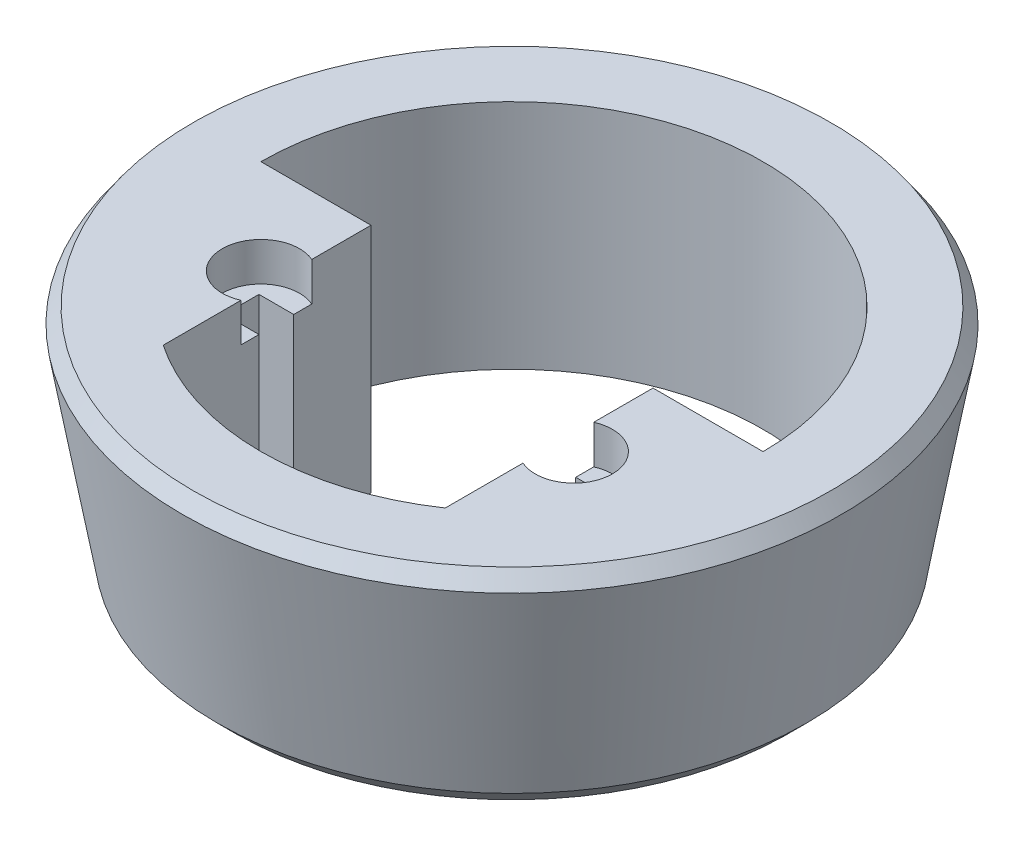
ISO-10303-21;
HEADER;
FILE_DESCRIPTION(('STEP AP214'),'2;1');
FILE_NAME('part.step','',(''),(''),'','','');
FILE_SCHEMA(('AUTOMOTIVE_DESIGN { 1 0 10303 214 1 1 1 1 }'));
ENDSEC;
DATA;
#1=APPLICATION_CONTEXT('core data for automotive mechanical design processes');
#2=APPLICATION_PROTOCOL_DEFINITION('international standard','automotive_design',2000,#1);
#3=PRODUCT_CONTEXT('',#1,'mechanical');
#4=PRODUCT('Part','Part','',(#3));
#5=PRODUCT_RELATED_PRODUCT_CATEGORY('part','',(#4));
#6=PRODUCT_DEFINITION_FORMATION('','',#4);
#7=PRODUCT_DEFINITION_CONTEXT('part definition',#1,'design');
#8=PRODUCT_DEFINITION('design','',#6,#7);
#9=PRODUCT_DEFINITION_SHAPE('','',#8);
#10=(LENGTH_UNIT() NAMED_UNIT(*) SI_UNIT(.MILLI.,.METRE.));
#11=(NAMED_UNIT(*) PLANE_ANGLE_UNIT() SI_UNIT($,.RADIAN.));
#12=(NAMED_UNIT(*) SI_UNIT($,.STERADIAN.) SOLID_ANGLE_UNIT());
#13=UNCERTAINTY_MEASURE_WITH_UNIT(LENGTH_MEASURE(1.E-05),#10,'distance_accuracy_value','');
#14=(GEOMETRIC_REPRESENTATION_CONTEXT(3) GLOBAL_UNCERTAINTY_ASSIGNED_CONTEXT((#13)) GLOBAL_UNIT_ASSIGNED_CONTEXT((#10,
#11,#12)) REPRESENTATION_CONTEXT('',''));
#15=CARTESIAN_POINT('',(0.,0.,0.));
#16=DIRECTION('',(0.,0.,1.));
#17=DIRECTION('',(1.,0.,0.));
#18=AXIS2_PLACEMENT_3D('',#15,#16,#17);
#19=CARTESIAN_POINT('',(-9.1,-12.,5.8));
#20=DIRECTION('',(-1.,0.,0.));
#21=DIRECTION('',(0.,0.,1.));
#22=AXIS2_PLACEMENT_3D('',#19,#20,#21);
#23=PLANE('',#22);
#24=DIRECTION('',(0.,0.,-1.));
#25=VECTOR('',#24,1.);
#26=CARTESIAN_POINT('',(-9.1,-2.,5.8));
#27=LINE('',#26,#25);
#28=CARTESIAN_POINT('',(-9.1,-2.,5.8));
#29=VERTEX_POINT('',#28);
#30=CARTESIAN_POINT('',(-9.1,-2.,4.));
#31=VERTEX_POINT('',#30);
#32=EDGE_CURVE('E361',#29,#31,#27,.T.);
#33=ORIENTED_EDGE('',*,*,#32,.F.);
#34=DIRECTION('',(0.,1.,0.));
#35=VECTOR('',#34,1.);
#36=CARTESIAN_POINT('',(-9.1,-12.,5.8));
#37=LINE('',#36,#35);
#38=CARTESIAN_POINT('',(-9.1,-12.,5.8));
#39=VERTEX_POINT('',#38);
#40=EDGE_CURVE('E237',#39,#29,#37,.T.);
#41=ORIENTED_EDGE('',*,*,#40,.F.);
#42=DIRECTION('',(0.,0.,1.));
#43=VECTOR('',#42,1.);
#44=CARTESIAN_POINT('',(-9.1,-12.,5.8));
#45=LINE('',#44,#43);
#46=CARTESIAN_POINT('',(-9.1,-12.,4.));
#47=VERTEX_POINT('',#46);
#48=EDGE_CURVE('E202',#47,#39,#45,.T.);
#49=ORIENTED_EDGE('',*,*,#48,.F.);
#50=DIRECTION('',(0.,1.,0.));
#51=VECTOR('',#50,1.);
#52=CARTESIAN_POINT('',(-9.1,-12.,4.));
#53=LINE('',#52,#51);
#54=EDGE_CURVE('E203',#47,#31,#53,.T.);
#55=ORIENTED_EDGE('',*,*,#54,.T.);
#56=EDGE_LOOP('',(#33,#41,#49,#55));
#57=FACE_BOUND('',#56,.T.);
#58=ADVANCED_FACE('F33',(#57),#23,.F.);
#59=CARTESIAN_POINT('',(-9.1,-12.,4.));
#60=DIRECTION('',(0.,0.,-1.));
#61=DIRECTION('',(-1.,0.,0.));
#62=AXIS2_PLACEMENT_3D('',#59,#60,#61);
#63=PLANE('',#62);
#64=DIRECTION('',(1.,0.,0.));
#65=VECTOR('',#64,1.);
#66=CARTESIAN_POINT('',(-9.1,-2.,4.));
#67=LINE('',#66,#65);
#68=CARTESIAN_POINT('',(-7.3,-2.,4.));
#69=VERTEX_POINT('',#68);
#70=EDGE_CURVE('E363',#31,#69,#67,.T.);
#71=ORIENTED_EDGE('',*,*,#70,.F.);
#72=ORIENTED_EDGE('',*,*,#54,.F.);
#73=DIRECTION('',(-1.,0.,0.));
#74=VECTOR('',#73,1.);
#75=CARTESIAN_POINT('',(-9.1,-12.,4.));
#76=LINE('',#75,#74);
#77=CARTESIAN_POINT('',(-7.3,-12.,4.));
#78=VERTEX_POINT('',#77);
#79=EDGE_CURVE('E240',#78,#47,#76,.T.);
#80=ORIENTED_EDGE('',*,*,#79,.F.);
#81=DIRECTION('',(0.,1.,0.));
#82=VECTOR('',#81,1.);
#83=CARTESIAN_POINT('',(-7.3,-12.,4.));
#84=LINE('',#83,#82);
#85=EDGE_CURVE('E207',#78,#69,#84,.T.);
#86=ORIENTED_EDGE('',*,*,#85,.T.);
#87=EDGE_LOOP('',(#71,#72,#80,#86));
#88=FACE_BOUND('',#87,.T.);
#89=ADVANCED_FACE('F274',(#88),#63,.F.);
#90=CARTESIAN_POINT('',(-9.1,-12.,5.8));
#91=DIRECTION('',(0.,0.,1.));
#92=DIRECTION('',(1.,0.,0.));
#93=AXIS2_PLACEMENT_3D('',#90,#91,#92);
#94=PLANE('',#93);
#95=DIRECTION('',(-1.,0.,0.));
#96=VECTOR('',#95,1.);
#97=CARTESIAN_POINT('',(-9.1,-2.,5.8));
#98=LINE('',#97,#96);
#99=CARTESIAN_POINT('',(-7.3,-2.,5.8));
#100=VERTEX_POINT('',#99);
#101=EDGE_CURVE('E206',#100,#29,#98,.T.);
#102=ORIENTED_EDGE('',*,*,#101,.F.);
#103=DIRECTION('',(0.,1.,0.));
#104=VECTOR('',#103,1.);
#105=CARTESIAN_POINT('',(-7.3,-12.,5.8));
#106=LINE('',#105,#104);
#107=CARTESIAN_POINT('',(-7.3,-12.,5.8));
#108=VERTEX_POINT('',#107);
#109=EDGE_CURVE('E234',#108,#100,#106,.T.);
#110=ORIENTED_EDGE('',*,*,#109,.F.);
#111=DIRECTION('',(1.,0.,0.));
#112=VECTOR('',#111,1.);
#113=CARTESIAN_POINT('',(-9.1,-12.,5.8));
#114=LINE('',#113,#112);
#115=EDGE_CURVE('E305',#39,#108,#114,.T.);
#116=ORIENTED_EDGE('',*,*,#115,.F.);
#117=ORIENTED_EDGE('',*,*,#40,.T.);
#118=EDGE_LOOP('',(#102,#110,#116,#117));
#119=FACE_BOUND('',#118,.T.);
#120=ADVANCED_FACE('F266',(#119),#94,.F.);
#121=CARTESIAN_POINT('',(0.,0.,0.));
#122=DIRECTION('',(0.,1.,0.));
#123=DIRECTION('',(0.,0.,1.));
#124=AXIS2_PLACEMENT_3D('',#121,#122,#123);
#125=PLANE('',#124);
#126=CARTESIAN_POINT('',(0.,0.,0.));
#127=DIRECTION('',(0.,1.,0.));
#128=DIRECTION('',(0.,0.,1.));
#129=AXIS2_PLACEMENT_3D('',#126,#127,#128);
#130=CIRCLE('',#129,16.5088020253873);
#131=CARTESIAN_POINT('',(0.,0.,16.5088020253873));
#132=VERTEX_POINT('',#131);
#133=EDGE_CURVE('E248',#132,#132,#130,.T.);
#134=ORIENTED_EDGE('',*,*,#133,.T.);
#135=EDGE_LOOP('',(#134));
#136=FACE_BOUND('',#135,.T.);
#137=CARTESIAN_POINT('',(8.1,0.,4.9));
#138=DIRECTION('',(0.,1.,0.));
#139=DIRECTION('',(0.,0.,-1.));
#140=AXIS2_PLACEMENT_3D('',#137,#138,#139);
#141=CIRCLE('',#140,2.);
#142=CARTESIAN_POINT('',(7.30000000000001,0.,6.73303027798233));
#143=VERTEX_POINT('',#142);
#144=CARTESIAN_POINT('',(7.30000000000001,0.,3.06696972201766));
#145=VERTEX_POINT('',#144);
#146=EDGE_CURVE('E158',#143,#145,#141,.T.);
#147=ORIENTED_EDGE('',*,*,#146,.F.);
#148=DIRECTION('',(0.,0.,-1.));
#149=VECTOR('',#148,1.);
#150=CARTESIAN_POINT('',(7.30000000000001,0.,5.8));
#151=LINE('',#150,#149);
#152=CARTESIAN_POINT('',(7.30000000000001,0.,10.7568582773968));
#153=VERTEX_POINT('',#152);
#154=EDGE_CURVE('E186',#153,#143,#151,.T.);
#155=ORIENTED_EDGE('',*,*,#154,.F.);
#156=CARTESIAN_POINT('',(0.,0.,0.));
#157=DIRECTION('',(0.,1.,0.));
#158=DIRECTION('',(0.,0.,1.));
#159=AXIS2_PLACEMENT_3D('',#156,#157,#158);
#160=CIRCLE('',#159,13.);
#161=CARTESIAN_POINT('',(-7.3,0.,10.7568582773968));
#162=VERTEX_POINT('',#161);
#163=EDGE_CURVE('E190',#162,#153,#160,.T.);
#164=ORIENTED_EDGE('',*,*,#163,.F.);
#165=DIRECTION('',(0.,0.,1.));
#166=VECTOR('',#165,1.);
#167=CARTESIAN_POINT('',(-7.3,0.,5.8));
#168=LINE('',#167,#166);
#169=CARTESIAN_POINT('',(-7.3,0.,6.73303027798234));
#170=VERTEX_POINT('',#169);
#171=EDGE_CURVE('E346',#170,#162,#168,.T.);
#172=ORIENTED_EDGE('',*,*,#171,.F.);
#173=CARTESIAN_POINT('',(-8.1,0.,4.9));
#174=DIRECTION('',(0.,1.,0.));
#175=DIRECTION('',(0.,0.,1.));
#176=AXIS2_PLACEMENT_3D('',#173,#174,#175);
#177=CIRCLE('',#176,2.);
#178=CARTESIAN_POINT('',(-7.3,0.,3.06696972201766));
#179=VERTEX_POINT('',#178);
#180=EDGE_CURVE('E179',#179,#170,#177,.T.);
#181=ORIENTED_EDGE('',*,*,#180,.F.);
#182=DIRECTION('',(0.,0.,1.));
#183=VECTOR('',#182,1.);
#184=CARTESIAN_POINT('',(-7.3,0.,4.));
#185=LINE('',#184,#183);
#186=CARTESIAN_POINT('',(-7.3,0.,0.));
#187=VERTEX_POINT('',#186);
#188=EDGE_CURVE('E199',#187,#179,#185,.T.);
#189=ORIENTED_EDGE('',*,*,#188,.F.);
#190=DIRECTION('',(1.,0.,0.));
#191=VECTOR('',#190,1.);
#192=CARTESIAN_POINT('',(-7.3,0.,0.));
#193=LINE('',#192,#191);
#194=CARTESIAN_POINT('',(-13.,0.,0.));
#195=VERTEX_POINT('',#194);
#196=EDGE_CURVE('E196',#195,#187,#193,.T.);
#197=ORIENTED_EDGE('',*,*,#196,.F.);
#198=CARTESIAN_POINT('',(0.,0.,0.));
#199=DIRECTION('',(0.,1.,0.));
#200=DIRECTION('',(0.,0.,1.));
#201=AXIS2_PLACEMENT_3D('',#198,#199,#200);
#202=CIRCLE('',#201,13.);
#203=CARTESIAN_POINT('',(13.,0.,0.));
#204=VERTEX_POINT('',#203);
#205=EDGE_CURVE('E188',#204,#195,#202,.T.);
#206=ORIENTED_EDGE('',*,*,#205,.F.);
#207=DIRECTION('',(1.,0.,0.));
#208=VECTOR('',#207,1.);
#209=CARTESIAN_POINT('',(7.3,0.,0.));
#210=LINE('',#209,#208);
#211=CARTESIAN_POINT('',(7.3,0.,0.));
#212=VERTEX_POINT('',#211);
#213=EDGE_CURVE('E185',#212,#204,#210,.T.);
#214=ORIENTED_EDGE('',*,*,#213,.F.);
#215=DIRECTION('',(0.,0.,-1.));
#216=VECTOR('',#215,1.);
#217=CARTESIAN_POINT('',(7.30000000000001,0.,4.));
#218=LINE('',#217,#216);
#219=EDGE_CURVE('E175',#145,#212,#218,.T.);
#220=ORIENTED_EDGE('',*,*,#219,.F.);
#221=EDGE_LOOP('',(#147,#155,#164,#172,#181,#189,#197,#206,#214,#220));
#222=FACE_BOUND('',#221,.T.);
#223=ADVANCED_FACE('F182',(#136,#222),#125,.T.);
#224=CARTESIAN_POINT('',(0.,0.,0.));
#225=DIRECTION('',(0.,1.,0.));
#226=DIRECTION('',(0.,0.,1.));
#227=AXIS2_PLACEMENT_3D('',#224,#225,#226);
#228=CONICAL_SURFACE('',#227,17.2,0.173245666452365);
#229=CARTESIAN_POINT('',(0.,-0.788024373724577,0.));
#230=DIRECTION('',(0.,-1.,0.));
#231=DIRECTION('',(0.,0.,-1.));
#232=AXIS2_PLACEMENT_3D('',#229,#230,#231);
#233=CIRCLE('',#232,17.0620957345982);
#234=CARTESIAN_POINT('',(0.,-0.788024373724577,-17.0620957345982));
#235=VERTEX_POINT('',#234);
#236=EDGE_CURVE('E41',#235,#235,#233,.T.);
#237=ORIENTED_EDGE('',*,*,#236,.T.);
#238=EDGE_LOOP('',(#237));
#239=FACE_BOUND('',#238,.T.);
#240=CARTESIAN_POINT('',(0.,-11.030303030303,0.));
#241=DIRECTION('',(0.,-1.,0.));
#242=DIRECTION('',(0.,0.,-1.));
#243=AXIS2_PLACEMENT_3D('',#240,#241,#242);
#244=CIRCLE('',#243,15.269696969697);
#245=CARTESIAN_POINT('',(0.,-11.030303030303,15.269696969697));
#246=VERTEX_POINT('',#245);
#247=EDGE_CURVE('E251',#246,#246,#244,.F.);
#248=ORIENTED_EDGE('',*,*,#247,.T.);
#249=EDGE_LOOP('',(#248));
#250=FACE_BOUND('',#249,.T.);
#251=ADVANCED_FACE('F256',(#239,#250),#228,.T.);
#252=CARTESIAN_POINT('',(-15.1,-12.,0.));
#253=DIRECTION('',(0.,-1.,0.));
#254=DIRECTION('',(0.,0.,-1.));
#255=AXIS2_PLACEMENT_3D('',#252,#253,#254);
#256=PLANE('',#255);
#257=CARTESIAN_POINT('',(0.,-12.,0.));
#258=DIRECTION('',(0.,-1.,0.));
#259=DIRECTION('',(0.,0.,-1.));
#260=AXIS2_PLACEMENT_3D('',#257,#258,#259);
#261=CIRCLE('',#260,14.3);
#262=CARTESIAN_POINT('',(0.,-12.,14.3));
#263=VERTEX_POINT('',#262);
#264=EDGE_CURVE('E11',#263,#263,#261,.T.);
#265=ORIENTED_EDGE('',*,*,#264,.T.);
#266=EDGE_LOOP('',(#265));
#267=FACE_BOUND('',#266,.T.);
#268=ORIENTED_EDGE('',*,*,#48,.T.);
#269=ORIENTED_EDGE('',*,*,#115,.T.);
#270=DIRECTION('',(0.,0.,1.));
#271=VECTOR('',#270,1.);
#272=CARTESIAN_POINT('',(-7.3,-12.,5.8));
#273=LINE('',#272,#271);
#274=CARTESIAN_POINT('',(-7.3,-12.,10.7568582773968));
#275=VERTEX_POINT('',#274);
#276=EDGE_CURVE('E309',#108,#275,#273,.T.);
#277=ORIENTED_EDGE('',*,*,#276,.T.);
#278=CARTESIAN_POINT('',(0.,-12.,0.));
#279=DIRECTION('',(0.,1.,0.));
#280=DIRECTION('',(0.,0.,1.));
#281=AXIS2_PLACEMENT_3D('',#278,#279,#280);
#282=CIRCLE('',#281,13.);
#283=CARTESIAN_POINT('',(7.30000000000001,-12.,10.7568582773968));
#284=VERTEX_POINT('',#283);
#285=EDGE_CURVE('E316',#275,#284,#282,.T.);
#286=ORIENTED_EDGE('',*,*,#285,.T.);
#287=DIRECTION('',(0.,0.,-1.));
#288=VECTOR('',#287,1.);
#289=CARTESIAN_POINT('',(7.30000000000001,-12.,5.8));
#290=LINE('',#289,#288);
#291=CARTESIAN_POINT('',(7.30000000000001,-12.,5.8));
#292=VERTEX_POINT('',#291);
#293=EDGE_CURVE('E319',#284,#292,#290,.T.);
#294=ORIENTED_EDGE('',*,*,#293,.T.);
#295=DIRECTION('',(1.,0.,0.));
#296=VECTOR('',#295,1.);
#297=CARTESIAN_POINT('',(7.30000000000001,-12.,5.8));
#298=LINE('',#297,#296);
#299=CARTESIAN_POINT('',(9.1,-12.,5.8));
#300=VERTEX_POINT('',#299);
#301=EDGE_CURVE('E322',#292,#300,#298,.T.);
#302=ORIENTED_EDGE('',*,*,#301,.T.);
#303=DIRECTION('',(0.,0.,-1.));
#304=VECTOR('',#303,1.);
#305=CARTESIAN_POINT('',(9.1,-12.,5.8));
#306=LINE('',#305,#304);
#307=CARTESIAN_POINT('',(9.1,-12.,4.));
#308=VERTEX_POINT('',#307);
#309=EDGE_CURVE('E325',#300,#308,#306,.T.);
#310=ORIENTED_EDGE('',*,*,#309,.T.);
#311=DIRECTION('',(-1.,0.,0.));
#312=VECTOR('',#311,1.);
#313=CARTESIAN_POINT('',(7.30000000000001,-12.,4.));
#314=LINE('',#313,#312);
#315=CARTESIAN_POINT('',(7.30000000000001,-12.,4.));
#316=VERTEX_POINT('',#315);
#317=EDGE_CURVE('E328',#308,#316,#314,.T.);
#318=ORIENTED_EDGE('',*,*,#317,.T.);
#319=DIRECTION('',(0.,0.,-1.));
#320=VECTOR('',#319,1.);
#321=CARTESIAN_POINT('',(7.30000000000001,-12.,4.));
#322=LINE('',#321,#320);
#323=CARTESIAN_POINT('',(7.3,-12.,0.));
#324=VERTEX_POINT('',#323);
#325=EDGE_CURVE('E331',#316,#324,#322,.T.);
#326=ORIENTED_EDGE('',*,*,#325,.T.);
#327=DIRECTION('',(1.,0.,0.));
#328=VECTOR('',#327,1.);
#329=CARTESIAN_POINT('',(7.3,-12.,0.));
#330=LINE('',#329,#328);
#331=CARTESIAN_POINT('',(13.,-12.,0.));
#332=VERTEX_POINT('',#331);
#333=EDGE_CURVE('E334',#324,#332,#330,.T.);
#334=ORIENTED_EDGE('',*,*,#333,.T.);
#335=CARTESIAN_POINT('',(0.,-12.,0.));
#336=DIRECTION('',(0.,1.,0.));
#337=DIRECTION('',(0.,0.,1.));
#338=AXIS2_PLACEMENT_3D('',#335,#336,#337);
#339=CIRCLE('',#338,13.);
#340=CARTESIAN_POINT('',(-13.,-12.,0.));
#341=VERTEX_POINT('',#340);
#342=EDGE_CURVE('E337',#332,#341,#339,.T.);
#343=ORIENTED_EDGE('',*,*,#342,.T.);
#344=DIRECTION('',(1.,0.,0.));
#345=VECTOR('',#344,1.);
#346=CARTESIAN_POINT('',(-7.3,-12.,0.));
#347=LINE('',#346,#345);
#348=CARTESIAN_POINT('',(-7.3,-12.,0.));
#349=VERTEX_POINT('',#348);
#350=EDGE_CURVE('E340',#341,#349,#347,.T.);
#351=ORIENTED_EDGE('',*,*,#350,.T.);
#352=DIRECTION('',(0.,0.,1.));
#353=VECTOR('',#352,1.);
#354=CARTESIAN_POINT('',(-7.3,-12.,4.));
#355=LINE('',#354,#353);
#356=EDGE_CURVE('E343',#349,#78,#355,.T.);
#357=ORIENTED_EDGE('',*,*,#356,.T.);
#358=ORIENTED_EDGE('',*,*,#79,.T.);
#359=EDGE_LOOP('',(#268,#269,#277,#286,#294,#302,#310,#318,#326,#334,#343,#351,#357,#358));
#360=FACE_BOUND('',#359,.T.);
#361=ADVANCED_FACE('F272',(#267,#360),#256,.T.);
#362=CARTESIAN_POINT('',(-7.3,-12.,4.));
#363=DIRECTION('',(-1.,0.,0.));
#364=DIRECTION('',(0.,0.,1.));
#365=AXIS2_PLACEMENT_3D('',#362,#363,#364);
#366=PLANE('',#365);
#367=ORIENTED_EDGE('',*,*,#188,.T.);
#368=DIRECTION('',(0.,1.,0.));
#369=VECTOR('',#368,1.);
#370=CARTESIAN_POINT('',(-7.3,-2.,3.06696972201766));
#371=LINE('',#370,#369);
#372=CARTESIAN_POINT('',(-7.3,-2.,3.06696972201766));
#373=VERTEX_POINT('',#372);
#374=EDGE_CURVE('E312',#179,#373,#371,.F.);
#375=ORIENTED_EDGE('',*,*,#374,.T.);
#376=DIRECTION('',(0.,0.,-1.));
#377=VECTOR('',#376,1.);
#378=CARTESIAN_POINT('',(-7.3,-2.,4.));
#379=LINE('',#378,#377);
#380=EDGE_CURVE('E365',#69,#373,#379,.T.);
#381=ORIENTED_EDGE('',*,*,#380,.F.);
#382=ORIENTED_EDGE('',*,*,#85,.F.);
#383=ORIENTED_EDGE('',*,*,#356,.F.);
#384=DIRECTION('',(0.,1.,0.));
#385=VECTOR('',#384,1.);
#386=CARTESIAN_POINT('',(-7.3,-12.,0.));
#387=LINE('',#386,#385);
#388=EDGE_CURVE('E210',#349,#187,#387,.T.);
#389=ORIENTED_EDGE('',*,*,#388,.T.);
#390=EDGE_LOOP('',(#367,#375,#381,#382,#383,#389));
#391=FACE_BOUND('',#390,.T.);
#392=ADVANCED_FACE('F289',(#391),#366,.F.);
#393=CARTESIAN_POINT('',(-7.3,-12.,0.));
#394=DIRECTION('',(0.,0.,1.));
#395=DIRECTION('',(1.,0.,0.));
#396=AXIS2_PLACEMENT_3D('',#393,#394,#395);
#397=PLANE('',#396);
#398=ORIENTED_EDGE('',*,*,#196,.T.);
#399=ORIENTED_EDGE('',*,*,#388,.F.);
#400=ORIENTED_EDGE('',*,*,#350,.F.);
#401=DIRECTION('',(0.,1.,0.));
#402=VECTOR('',#401,1.);
#403=CARTESIAN_POINT('',(-13.,-12.,0.));
#404=LINE('',#403,#402);
#405=EDGE_CURVE('E212',#341,#195,#404,.T.);
#406=ORIENTED_EDGE('',*,*,#405,.T.);
#407=EDGE_LOOP('',(#398,#399,#400,#406));
#408=FACE_BOUND('',#407,.T.);
#409=ADVANCED_FACE('F294',(#408),#397,.F.);
#410=CARTESIAN_POINT('',(0.,-12.,0.));
#411=DIRECTION('',(0.,1.,0.));
#412=DIRECTION('',(0.,0.,1.));
#413=AXIS2_PLACEMENT_3D('',#410,#411,#412);
#414=CYLINDRICAL_SURFACE('',#413,13.);
#415=ORIENTED_EDGE('',*,*,#205,.T.);
#416=ORIENTED_EDGE('',*,*,#405,.F.);
#417=ORIENTED_EDGE('',*,*,#342,.F.);
#418=DIRECTION('',(0.,1.,0.));
#419=VECTOR('',#418,1.);
#420=CARTESIAN_POINT('',(13.,-12.,0.));
#421=LINE('',#420,#419);
#422=EDGE_CURVE('E214',#332,#204,#421,.T.);
#423=ORIENTED_EDGE('',*,*,#422,.T.);
#424=EDGE_LOOP('',(#415,#416,#417,#423));
#425=FACE_BOUND('',#424,.T.);
#426=ADVANCED_FACE('F402',(#425),#414,.F.);
#427=CARTESIAN_POINT('',(7.3,-12.,0.));
#428=DIRECTION('',(0.,0.,1.));
#429=DIRECTION('',(1.,0.,0.));
#430=AXIS2_PLACEMENT_3D('',#427,#428,#429);
#431=PLANE('',#430);
#432=ORIENTED_EDGE('',*,*,#213,.T.);
#433=ORIENTED_EDGE('',*,*,#422,.F.);
#434=ORIENTED_EDGE('',*,*,#333,.F.);
#435=DIRECTION('',(0.,1.,0.));
#436=VECTOR('',#435,1.);
#437=CARTESIAN_POINT('',(7.3,-12.,0.));
#438=LINE('',#437,#436);
#439=EDGE_CURVE('E216',#324,#212,#438,.T.);
#440=ORIENTED_EDGE('',*,*,#439,.T.);
#441=EDGE_LOOP('',(#432,#433,#434,#440));
#442=FACE_BOUND('',#441,.T.);
#443=ADVANCED_FACE('F400',(#442),#431,.F.);
#444=CARTESIAN_POINT('',(7.30000000000001,-12.,4.));
#445=DIRECTION('',(1.,0.,0.));
#446=DIRECTION('',(0.,0.,-1.));
#447=AXIS2_PLACEMENT_3D('',#444,#445,#446);
#448=PLANE('',#447);
#449=DIRECTION('',(0.,0.,-1.));
#450=VECTOR('',#449,1.);
#451=CARTESIAN_POINT('',(7.30000000000001,-2.,4.));
#452=LINE('',#451,#450);
#453=CARTESIAN_POINT('',(7.30000000000001,-2.,4.));
#454=VERTEX_POINT('',#453);
#455=CARTESIAN_POINT('',(7.30000000000001,-2.,3.06696972201766));
#456=VERTEX_POINT('',#455);
#457=EDGE_CURVE('E178',#454,#456,#452,.T.);
#458=ORIENTED_EDGE('',*,*,#457,.T.);
#459=DIRECTION('',(0.,1.,0.));
#460=VECTOR('',#459,1.);
#461=CARTESIAN_POINT('',(7.30000000000001,-2.,3.06696972201766));
#462=LINE('',#461,#460);
#463=EDGE_CURVE('E162',#456,#145,#462,.T.);
#464=ORIENTED_EDGE('',*,*,#463,.T.);
#465=ORIENTED_EDGE('',*,*,#219,.T.);
#466=ORIENTED_EDGE('',*,*,#439,.F.);
#467=ORIENTED_EDGE('',*,*,#325,.F.);
#468=DIRECTION('',(0.,1.,0.));
#469=VECTOR('',#468,1.);
#470=CARTESIAN_POINT('',(7.30000000000001,-12.,4.));
#471=LINE('',#470,#469);
#472=EDGE_CURVE('E218',#316,#454,#471,.T.);
#473=ORIENTED_EDGE('',*,*,#472,.T.);
#474=EDGE_LOOP('',(#458,#464,#465,#466,#467,#473));
#475=FACE_BOUND('',#474,.T.);
#476=ADVANCED_FACE('F174',(#475),#448,.F.);
#477=CARTESIAN_POINT('',(7.30000000000001,-12.,4.));
#478=DIRECTION('',(0.,0.,-1.));
#479=DIRECTION('',(-1.,0.,0.));
#480=AXIS2_PLACEMENT_3D('',#477,#478,#479);
#481=PLANE('',#480);
#482=DIRECTION('',(0.,1.,0.));
#483=VECTOR('',#482,1.);
#484=CARTESIAN_POINT('',(9.1,-12.,4.));
#485=LINE('',#484,#483);
#486=CARTESIAN_POINT('',(9.1,-2.,4.));
#487=VERTEX_POINT('',#486);
#488=EDGE_CURVE('E220',#308,#487,#485,.T.);
#489=ORIENTED_EDGE('',*,*,#488,.T.);
#490=DIRECTION('',(-1.,0.,0.));
#491=VECTOR('',#490,1.);
#492=CARTESIAN_POINT('',(7.30000000000001,-2.,4.));
#493=LINE('',#492,#491);
#494=EDGE_CURVE('E381',#487,#454,#493,.T.);
#495=ORIENTED_EDGE('',*,*,#494,.T.);
#496=ORIENTED_EDGE('',*,*,#472,.F.);
#497=ORIENTED_EDGE('',*,*,#317,.F.);
#498=EDGE_LOOP('',(#489,#495,#496,#497));
#499=FACE_BOUND('',#498,.T.);
#500=ADVANCED_FACE('F395',(#499),#481,.F.);
#501=CARTESIAN_POINT('',(9.1,-12.,5.8));
#502=DIRECTION('',(1.,0.,0.));
#503=DIRECTION('',(0.,0.,-1.));
#504=AXIS2_PLACEMENT_3D('',#501,#502,#503);
#505=PLANE('',#504);
#506=DIRECTION('',(0.,1.,0.));
#507=VECTOR('',#506,1.);
#508=CARTESIAN_POINT('',(9.1,-12.,5.8));
#509=LINE('',#508,#507);
#510=CARTESIAN_POINT('',(9.1,-2.,5.8));
#511=VERTEX_POINT('',#510);
#512=EDGE_CURVE('E223',#300,#511,#509,.T.);
#513=ORIENTED_EDGE('',*,*,#512,.T.);
#514=DIRECTION('',(0.,0.,-1.));
#515=VECTOR('',#514,1.);
#516=CARTESIAN_POINT('',(9.1,-2.,5.8));
#517=LINE('',#516,#515);
#518=EDGE_CURVE('E384',#511,#487,#517,.T.);
#519=ORIENTED_EDGE('',*,*,#518,.T.);
#520=ORIENTED_EDGE('',*,*,#488,.F.);
#521=ORIENTED_EDGE('',*,*,#309,.F.);
#522=EDGE_LOOP('',(#513,#519,#520,#521));
#523=FACE_BOUND('',#522,.T.);
#524=ADVANCED_FACE('F393',(#523),#505,.F.);
#525=CARTESIAN_POINT('',(7.30000000000001,-12.,5.8));
#526=DIRECTION('',(0.,0.,1.));
#527=DIRECTION('',(1.,0.,0.));
#528=AXIS2_PLACEMENT_3D('',#525,#526,#527);
#529=PLANE('',#528);
#530=DIRECTION('',(0.,1.,0.));
#531=VECTOR('',#530,1.);
#532=CARTESIAN_POINT('',(7.30000000000001,-12.,5.8));
#533=LINE('',#532,#531);
#534=CARTESIAN_POINT('',(7.30000000000001,-2.,5.8));
#535=VERTEX_POINT('',#534);
#536=EDGE_CURVE('E226',#292,#535,#533,.T.);
#537=ORIENTED_EDGE('',*,*,#536,.T.);
#538=DIRECTION('',(1.,0.,0.));
#539=VECTOR('',#538,1.);
#540=CARTESIAN_POINT('',(7.30000000000001,-2.,5.8));
#541=LINE('',#540,#539);
#542=EDGE_CURVE('E48',#535,#511,#541,.T.);
#543=ORIENTED_EDGE('',*,*,#542,.T.);
#544=ORIENTED_EDGE('',*,*,#512,.F.);
#545=ORIENTED_EDGE('',*,*,#301,.F.);
#546=EDGE_LOOP('',(#537,#543,#544,#545));
#547=FACE_BOUND('',#546,.T.);
#548=ADVANCED_FACE('F389',(#547),#529,.F.);
#549=CARTESIAN_POINT('',(7.30000000000001,-12.,5.8));
#550=DIRECTION('',(1.,0.,0.));
#551=DIRECTION('',(0.,0.,-1.));
#552=AXIS2_PLACEMENT_3D('',#549,#550,#551);
#553=PLANE('',#552);
#554=ORIENTED_EDGE('',*,*,#154,.T.);
#555=DIRECTION('',(0.,1.,0.));
#556=VECTOR('',#555,1.);
#557=CARTESIAN_POINT('',(7.30000000000001,-2.,6.73303027798233));
#558=LINE('',#557,#556);
#559=CARTESIAN_POINT('',(7.30000000000001,-2.,6.73303027798233));
#560=VERTEX_POINT('',#559);
#561=EDGE_CURVE('E165',#143,#560,#558,.F.);
#562=ORIENTED_EDGE('',*,*,#561,.T.);
#563=DIRECTION('',(0.,0.,-1.));
#564=VECTOR('',#563,1.);
#565=CARTESIAN_POINT('',(7.30000000000001,-2.,5.8));
#566=LINE('',#565,#564);
#567=EDGE_CURVE('E245',#560,#535,#566,.T.);
#568=ORIENTED_EDGE('',*,*,#567,.T.);
#569=ORIENTED_EDGE('',*,*,#536,.F.);
#570=ORIENTED_EDGE('',*,*,#293,.F.);
#571=DIRECTION('',(0.,1.,0.));
#572=VECTOR('',#571,1.);
#573=CARTESIAN_POINT('',(7.30000000000001,-12.,10.7568582773968));
#574=LINE('',#573,#572);
#575=EDGE_CURVE('E229',#284,#153,#574,.T.);
#576=ORIENTED_EDGE('',*,*,#575,.T.);
#577=EDGE_LOOP('',(#554,#562,#568,#569,#570,#576));
#578=FACE_BOUND('',#577,.T.);
#579=ADVANCED_FACE('F355',(#578),#553,.F.);
#580=CARTESIAN_POINT('',(0.,-12.,0.));
#581=DIRECTION('',(0.,1.,0.));
#582=DIRECTION('',(0.,0.,1.));
#583=AXIS2_PLACEMENT_3D('',#580,#581,#582);
#584=CYLINDRICAL_SURFACE('',#583,13.);
#585=ORIENTED_EDGE('',*,*,#163,.T.);
#586=ORIENTED_EDGE('',*,*,#575,.F.);
#587=ORIENTED_EDGE('',*,*,#285,.F.);
#588=DIRECTION('',(0.,1.,0.));
#589=VECTOR('',#588,1.);
#590=CARTESIAN_POINT('',(-7.3,-12.,10.7568582773968));
#591=LINE('',#590,#589);
#592=EDGE_CURVE('E231',#275,#162,#591,.T.);
#593=ORIENTED_EDGE('',*,*,#592,.T.);
#594=EDGE_LOOP('',(#585,#586,#587,#593));
#595=FACE_BOUND('',#594,.T.);
#596=ADVANCED_FACE('F350',(#595),#584,.F.);
#597=CARTESIAN_POINT('',(-7.3,-12.,5.8));
#598=DIRECTION('',(-1.,0.,0.));
#599=DIRECTION('',(0.,0.,1.));
#600=AXIS2_PLACEMENT_3D('',#597,#598,#599);
#601=PLANE('',#600);
#602=DIRECTION('',(0.,0.,-1.));
#603=VECTOR('',#602,1.);
#604=CARTESIAN_POINT('',(-7.3,-2.,5.8));
#605=LINE('',#604,#603);
#606=CARTESIAN_POINT('',(-7.3,-2.,6.73303027798234));
#607=VERTEX_POINT('',#606);
#608=EDGE_CURVE('E56',#607,#100,#605,.T.);
#609=ORIENTED_EDGE('',*,*,#608,.F.);
#610=DIRECTION('',(0.,1.,0.));
#611=VECTOR('',#610,1.);
#612=CARTESIAN_POINT('',(-7.3,-2.,6.73303027798234));
#613=LINE('',#612,#611);
#614=EDGE_CURVE('E242',#607,#170,#613,.T.);
#615=ORIENTED_EDGE('',*,*,#614,.T.);
#616=ORIENTED_EDGE('',*,*,#171,.T.);
#617=ORIENTED_EDGE('',*,*,#592,.F.);
#618=ORIENTED_EDGE('',*,*,#276,.F.);
#619=ORIENTED_EDGE('',*,*,#109,.T.);
#620=EDGE_LOOP('',(#609,#615,#616,#617,#618,#619));
#621=FACE_BOUND('',#620,.T.);
#622=ADVANCED_FACE('F359',(#621),#601,.F.);
#623=CARTESIAN_POINT('',(-8.1,-2.,4.9));
#624=DIRECTION('',(0.,1.,0.));
#625=DIRECTION('',(0.,0.,1.));
#626=AXIS2_PLACEMENT_3D('',#623,#624,#625);
#627=CYLINDRICAL_SURFACE('',#626,2.);
#628=ORIENTED_EDGE('',*,*,#180,.T.);
#629=ORIENTED_EDGE('',*,*,#614,.F.);
#630=CARTESIAN_POINT('',(-8.1,-2.,4.9));
#631=DIRECTION('',(0.,1.,0.));
#632=DIRECTION('',(0.,0.,1.));
#633=AXIS2_PLACEMENT_3D('',#630,#631,#632);
#634=CIRCLE('',#633,2.);
#635=EDGE_CURVE('E367',#373,#607,#634,.T.);
#636=ORIENTED_EDGE('',*,*,#635,.F.);
#637=ORIENTED_EDGE('',*,*,#374,.F.);
#638=EDGE_LOOP('',(#628,#629,#636,#637));
#639=FACE_BOUND('',#638,.T.);
#640=ADVANCED_FACE('F376',(#639),#627,.F.);
#641=CARTESIAN_POINT('',(-8.1,-2.,4.9));
#642=DIRECTION('',(0.,1.,0.));
#643=DIRECTION('',(0.,0.,1.));
#644=AXIS2_PLACEMENT_3D('',#641,#642,#643);
#645=PLANE('',#644);
#646=ORIENTED_EDGE('',*,*,#380,.T.);
#647=ORIENTED_EDGE('',*,*,#635,.T.);
#648=ORIENTED_EDGE('',*,*,#608,.T.);
#649=ORIENTED_EDGE('',*,*,#101,.T.);
#650=ORIENTED_EDGE('',*,*,#32,.T.);
#651=ORIENTED_EDGE('',*,*,#70,.T.);
#652=EDGE_LOOP('',(#646,#647,#648,#649,#650,#651));
#653=FACE_BOUND('',#652,.T.);
#654=ADVANCED_FACE('F360',(#653),#645,.T.);
#655=CARTESIAN_POINT('',(8.1,-2.,4.9));
#656=DIRECTION('',(0.,1.,0.));
#657=DIRECTION('',(0.,0.,1.));
#658=AXIS2_PLACEMENT_3D('',#655,#656,#657);
#659=CYLINDRICAL_SURFACE('',#658,2.);
#660=CARTESIAN_POINT('',(8.1,-2.,4.9));
#661=DIRECTION('',(0.,1.,0.));
#662=DIRECTION('',(0.,0.,-1.));
#663=AXIS2_PLACEMENT_3D('',#660,#661,#662);
#664=CIRCLE('',#663,2.);
#665=EDGE_CURVE('E170',#560,#456,#664,.T.);
#666=ORIENTED_EDGE('',*,*,#665,.F.);
#667=ORIENTED_EDGE('',*,*,#561,.F.);
#668=ORIENTED_EDGE('',*,*,#146,.T.);
#669=ORIENTED_EDGE('',*,*,#463,.F.);
#670=EDGE_LOOP('',(#666,#667,#668,#669));
#671=FACE_BOUND('',#670,.T.);
#672=ADVANCED_FACE('F161',(#671),#659,.F.);
#673=CARTESIAN_POINT('',(8.1,-2.,4.9));
#674=DIRECTION('',(0.,-1.,0.));
#675=DIRECTION('',(0.,0.,-1.));
#676=AXIS2_PLACEMENT_3D('',#673,#674,#675);
#677=PLANE('',#676);
#678=ORIENTED_EDGE('',*,*,#494,.F.);
#679=ORIENTED_EDGE('',*,*,#518,.F.);
#680=ORIENTED_EDGE('',*,*,#542,.F.);
#681=ORIENTED_EDGE('',*,*,#567,.F.);
#682=ORIENTED_EDGE('',*,*,#665,.T.);
#683=ORIENTED_EDGE('',*,*,#457,.F.);
#684=EDGE_LOOP('',(#678,#679,#680,#681,#682,#683));
#685=FACE_BOUND('',#684,.T.);
#686=ADVANCED_FACE('F262',(#685),#677,.F.);
#687=CARTESIAN_POINT('',(0.,0.,0.));
#688=DIRECTION('',(0.,-1.,0.));
#689=DIRECTION('',(0.,0.,-1.));
#690=AXIS2_PLACEMENT_3D('',#687,#688,#689);
#691=CONICAL_SURFACE('',#690,16.5088020253873,0.612152496945077);
#692=ORIENTED_EDGE('',*,*,#236,.F.);
#693=EDGE_LOOP('',(#692));
#694=FACE_BOUND('',#693,.T.);
#695=ORIENTED_EDGE('',*,*,#133,.F.);
#696=EDGE_LOOP('',(#695));
#697=FACE_BOUND('',#696,.T.);
#698=ADVANCED_FACE('F259',(#694,#697),#691,.T.);
#699=CARTESIAN_POINT('',(0.,-11.030303030303,0.));
#700=DIRECTION('',(0.,1.,0.));
#701=DIRECTION('',(0.,0.,1.));
#702=AXIS2_PLACEMENT_3D('',#699,#700,#701);
#703=CONICAL_SURFACE('',#702,15.269696969697,0.785398163397449);
#704=CARTESIAN_POINT('',(0.,-12.,14.3));
#705=CARTESIAN_POINT('',(0.,-11.989898989899,14.310101010101));
#706=CARTESIAN_POINT('',(0.,-11.979797979798,14.320202020202));
#707=CARTESIAN_POINT('',(0.,-11.959595959596,14.340404040404));
#708=CARTESIAN_POINT('',(0.,-11.949494949495,14.350505050505));
#709=CARTESIAN_POINT('',(0.,-11.9292929292929,14.3707070707071));
#710=CARTESIAN_POINT('',(0.,-11.9191919191919,14.3808080808081));
#711=CARTESIAN_POINT('',(0.,-11.8989898989899,14.4010101010101));
#712=CARTESIAN_POINT('',(0.,-11.8888888888889,14.4111111111111));
#713=CARTESIAN_POINT('',(0.,-11.8686868686869,14.4313131313131));
#714=CARTESIAN_POINT('',(0.,-11.8585858585859,14.4414141414141));
#715=CARTESIAN_POINT('',(0.,-11.8383838383838,14.4616161616162));
#716=CARTESIAN_POINT('',(0.,-11.8282828282828,14.4717171717172));
#717=CARTESIAN_POINT('',(0.,-11.8080808080808,14.4919191919192));
#718=CARTESIAN_POINT('',(0.,-11.7979797979798,14.5020202020202));
#719=CARTESIAN_POINT('',(0.,-11.7777777777778,14.5222222222222));
#720=CARTESIAN_POINT('',(0.,-11.7676767676768,14.5323232323232));
#721=CARTESIAN_POINT('',(0.,-11.7474747474747,14.5525252525252));
#722=CARTESIAN_POINT('',(0.,-11.7373737373737,14.5626262626263));
#723=CARTESIAN_POINT('',(0.,-11.7171717171717,14.5828282828283));
#724=CARTESIAN_POINT('',(0.,-11.7070707070707,14.5929292929293));
#725=CARTESIAN_POINT('',(0.,-11.6868686868687,14.6131313131313));
#726=CARTESIAN_POINT('',(0.,-11.6767676767677,14.6232323232323));
#727=CARTESIAN_POINT('',(0.,-11.6565656565657,14.6434343434343));
#728=CARTESIAN_POINT('',(0.,-11.6464646464646,14.6535353535353));
#729=CARTESIAN_POINT('',(0.,-11.6262626262626,14.6737373737374));
#730=CARTESIAN_POINT('',(0.,-11.6161616161616,14.6838383838384));
#731=CARTESIAN_POINT('',(0.,-11.5959595959596,14.7040404040404));
#732=CARTESIAN_POINT('',(0.,-11.5858585858586,14.7141414141414));
#733=CARTESIAN_POINT('',(0.,-11.5656565656566,14.7343434343434));
#734=CARTESIAN_POINT('',(0.,-11.5555555555556,14.7444444444444));
#735=CARTESIAN_POINT('',(0.,-11.5353535353535,14.7646464646465));
#736=CARTESIAN_POINT('',(0.,-11.5252525252525,14.7747474747475));
#737=CARTESIAN_POINT('',(0.,-11.5050505050505,14.7949494949495));
#738=CARTESIAN_POINT('',(0.,-11.4949494949495,14.8050505050505));
#739=CARTESIAN_POINT('',(0.,-11.4747474747475,14.8252525252525));
#740=CARTESIAN_POINT('',(0.,-11.4646464646465,14.8353535353535));
#741=CARTESIAN_POINT('',(0.,-11.4444444444444,14.8555555555555));
#742=CARTESIAN_POINT('',(0.,-11.4343434343434,14.8656565656566));
#743=CARTESIAN_POINT('',(0.,-11.4141414141414,14.8858585858586));
#744=CARTESIAN_POINT('',(0.,-11.4040404040404,14.8959595959596));
#745=CARTESIAN_POINT('',(0.,-11.3838383838384,14.9161616161616));
#746=CARTESIAN_POINT('',(0.,-11.3737373737374,14.9262626262626));
#747=CARTESIAN_POINT('',(0.,-11.3535353535354,14.9464646464646));
#748=CARTESIAN_POINT('',(0.,-11.3434343434343,14.9565656565657));
#749=CARTESIAN_POINT('',(0.,-11.3232323232323,14.9767676767677));
#750=CARTESIAN_POINT('',(0.,-11.3131313131313,14.9868686868687));
#751=CARTESIAN_POINT('',(0.,-11.2929292929293,15.0070707070707));
#752=CARTESIAN_POINT('',(0.,-11.2828282828283,15.0171717171717));
#753=CARTESIAN_POINT('',(0.,-11.2626262626263,15.0373737373737));
#754=CARTESIAN_POINT('',(0.,-11.2525252525253,15.0474747474747));
#755=CARTESIAN_POINT('',(0.,-11.2323232323232,15.0676767676768));
#756=CARTESIAN_POINT('',(0.,-11.2222222222222,15.0777777777778));
#757=CARTESIAN_POINT('',(0.,-11.2020202020202,15.0979797979798));
#758=CARTESIAN_POINT('',(0.,-11.1919191919192,15.1080808080808));
#759=CARTESIAN_POINT('',(0.,-11.1717171717172,15.1282828282828));
#760=CARTESIAN_POINT('',(0.,-11.1616161616162,15.1383838383838));
#761=CARTESIAN_POINT('',(0.,-11.1414141414141,15.1585858585859));
#762=CARTESIAN_POINT('',(0.,-11.1313131313131,15.1686868686869));
#763=CARTESIAN_POINT('',(0.,-11.1111111111111,15.1888888888889));
#764=CARTESIAN_POINT('',(0.,-11.1010101010101,15.1989898989899));
#765=CARTESIAN_POINT('',(0.,-11.0808080808081,15.2191919191919));
#766=CARTESIAN_POINT('',(0.,-11.0707070707071,15.2292929292929));
#767=CARTESIAN_POINT('',(0.,-11.050505050505,15.2494949494949));
#768=CARTESIAN_POINT('',(0.,-11.040404040404,15.259595959596));
#769=CARTESIAN_POINT('',(0.,-11.030303030303,15.269696969697));
#770=B_SPLINE_CURVE_WITH_KNOTS('',3,(#704,#705,#706,#707,#708,#709,#710,#711,#712,#713,#714,
#715,#716,#717,#718,#719,#720,#721,#722,#723,#724,#725,#726,#727,#728,#729,#730,#731,#732,#733,
#734,#735,#736,#737,#738,#739,#740,#741,#742,#743,#744,#745,#746,#747,#748,#749,#750,#751,#752,
#753,#754,#755,#756,#757,#758,#759,#760,#761,#762,#763,#764,#765,#766,#767,#768,#769),
.UNSPECIFIED.,.F.,.F.,(4,2,2,2,2,2,2,2,2,2,2,2,2,2,2,2,2,2,2,2,2,2,2,2,2,2,2,2,2,2,2,2,4),(0.,
0.0428549564355501,0.0857099128710977,0.128564869306647,0.171419825742195,0.214274782177743,
0.257129738613293,0.299984695048841,0.342839651484388,0.385694607919938,0.428549564355486,
0.471404520791035,0.514259477226584,0.557114433662131,0.59996939009768,0.642824346533229,
0.685679302968777,0.728534259404326,0.771389215839875,0.814244172275423,0.857099128710971,
0.89995408514652,0.942809041582069,0.985663998017616,1.02851895445317,1.07137391088871,
1.11422886732426,1.15708382375981,1.19993878019536,1.24279373663091,1.28564869306646,
1.328503649502,1.37135860593755),.UNSPECIFIED.);
#771=EDGE_CURVE('BSEAM35',#263,#246,#770,.T.);
#772=ORIENTED_EDGE('',*,*,#264,.F.);
#773=ORIENTED_EDGE('',*,*,#247,.F.);
#774=ORIENTED_EDGE('',*,*,#771,.T.);
#775=ORIENTED_EDGE('',*,*,#771,.F.);
#776=EDGE_LOOP('',(#772,#774,#773,#775));
#777=FACE_BOUND('',#776,.T.);
#778=ADVANCED_FACE('F35',(#777),#703,.T.);
#779=CLOSED_SHELL('',(#58,#89,#120,#223,#251,#361,#392,#409,#426,#443,#476,#500,#524,#548,#579,
#596,#622,#640,#654,#672,#686,#698,#778));
#780=MANIFOLD_SOLID_BREP('B2',#779);
#781=ADVANCED_BREP_SHAPE_REPRESENTATION('',(#18,#780),#14);
#782=SHAPE_DEFINITION_REPRESENTATION(#9,#781);
ENDSEC;
END-ISO-10303-21;
